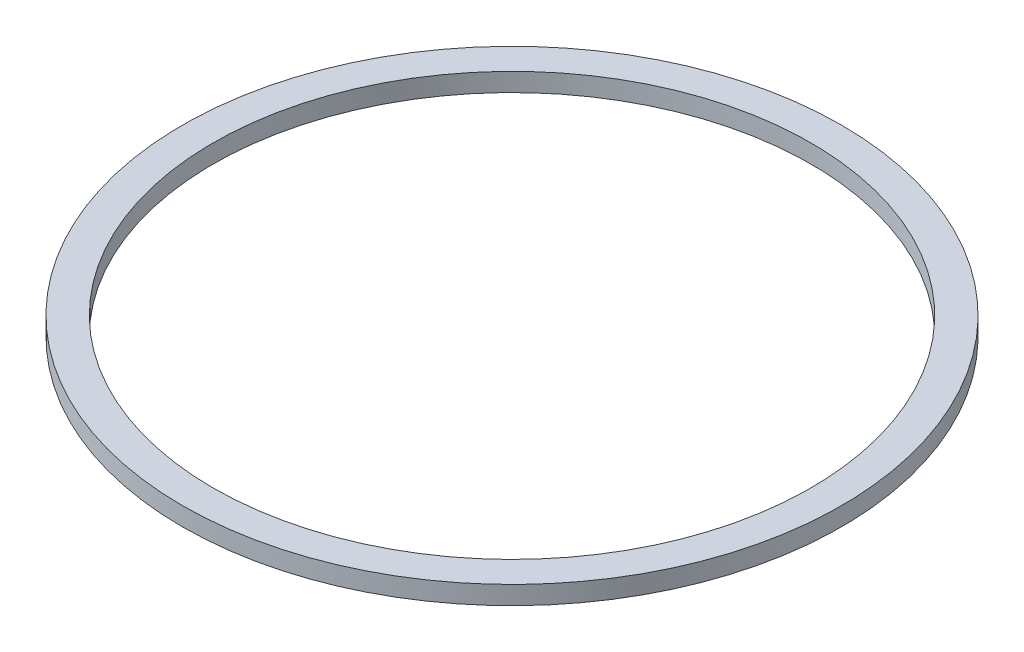
ISO-10303-21;
HEADER;
FILE_DESCRIPTION(('STEP AP214'),'2;1');
FILE_NAME('part.step','',(''),(''),'','','');
FILE_SCHEMA(('AUTOMOTIVE_DESIGN { 1 0 10303 214 1 1 1 1 }'));
ENDSEC;
DATA;
#1=APPLICATION_CONTEXT('core data for automotive mechanical design processes');
#2=APPLICATION_PROTOCOL_DEFINITION('international standard','automotive_design',2000,#1);
#3=PRODUCT_CONTEXT('',#1,'mechanical');
#4=PRODUCT('Part','Part','',(#3));
#5=PRODUCT_RELATED_PRODUCT_CATEGORY('part','',(#4));
#6=PRODUCT_DEFINITION_FORMATION('','',#4);
#7=PRODUCT_DEFINITION_CONTEXT('part definition',#1,'design');
#8=PRODUCT_DEFINITION('design','',#6,#7);
#9=PRODUCT_DEFINITION_SHAPE('','',#8);
#10=(LENGTH_UNIT() NAMED_UNIT(*) SI_UNIT(.MILLI.,.METRE.));
#11=(NAMED_UNIT(*) PLANE_ANGLE_UNIT() SI_UNIT($,.RADIAN.));
#12=(NAMED_UNIT(*) SI_UNIT($,.STERADIAN.) SOLID_ANGLE_UNIT());
#13=UNCERTAINTY_MEASURE_WITH_UNIT(LENGTH_MEASURE(1.E-05),#10,'distance_accuracy_value','');
#14=(GEOMETRIC_REPRESENTATION_CONTEXT(3) GLOBAL_UNCERTAINTY_ASSIGNED_CONTEXT((#13)) GLOBAL_UNIT_ASSIGNED_CONTEXT((#10,
#11,#12)) REPRESENTATION_CONTEXT('',''));
#15=CARTESIAN_POINT('',(0.,0.,0.));
#16=DIRECTION('',(0.,0.,1.));
#17=DIRECTION('',(1.,0.,0.));
#18=AXIS2_PLACEMENT_3D('',#15,#16,#17);
#19=CARTESIAN_POINT('',(0.,1.2,0.));
#20=DIRECTION('',(0.,1.,0.));
#21=DIRECTION('',(0.,0.,1.));
#22=AXIS2_PLACEMENT_3D('',#19,#20,#21);
#23=PLANE('',#22);
#24=CARTESIAN_POINT('',(0.,1.2,0.));
#25=DIRECTION('',(0.,1.,0.));
#26=DIRECTION('',(0.,0.,1.));
#27=AXIS2_PLACEMENT_3D('',#24,#25,#26);
#28=CIRCLE('',#27,21.5);
#29=CARTESIAN_POINT('',(0.,1.2,21.5));
#30=VERTEX_POINT('',#29);
#31=EDGE_CURVE('E10',#30,#30,#28,.T.);
#32=ORIENTED_EDGE('',*,*,#31,.T.);
#33=EDGE_LOOP('',(#32));
#34=FACE_BOUND('',#33,.T.);
#35=CARTESIAN_POINT('',(0.,1.2,0.));
#36=DIRECTION('',(0.,1.,0.));
#37=DIRECTION('',(0.,0.,1.));
#38=AXIS2_PLACEMENT_3D('',#35,#36,#37);
#39=CIRCLE('',#38,19.5);
#40=CARTESIAN_POINT('',(0.,1.2,19.5));
#41=VERTEX_POINT('',#40);
#42=EDGE_CURVE('E50',#41,#41,#39,.T.);
#43=ORIENTED_EDGE('',*,*,#42,.F.);
#44=EDGE_LOOP('',(#43));
#45=FACE_BOUND('',#44,.T.);
#46=ADVANCED_FACE('F37',(#34,#45),#23,.T.);
#47=CARTESIAN_POINT('',(0.,0.,0.));
#48=DIRECTION('',(0.,1.,0.));
#49=DIRECTION('',(0.,0.,1.));
#50=AXIS2_PLACEMENT_3D('',#47,#48,#49);
#51=PLANE('',#50);
#52=CARTESIAN_POINT('',(0.,0.,0.));
#53=DIRECTION('',(0.,1.,0.));
#54=DIRECTION('',(0.,0.,1.));
#55=AXIS2_PLACEMENT_3D('',#52,#53,#54);
#56=CIRCLE('',#55,21.5);
#57=CARTESIAN_POINT('',(0.,0.,21.5));
#58=VERTEX_POINT('',#57);
#59=EDGE_CURVE('E41',#58,#58,#56,.T.);
#60=ORIENTED_EDGE('',*,*,#59,.F.);
#61=EDGE_LOOP('',(#60));
#62=FACE_BOUND('',#61,.T.);
#63=CARTESIAN_POINT('',(0.,0.,0.));
#64=DIRECTION('',(0.,1.,0.));
#65=DIRECTION('',(0.,0.,1.));
#66=AXIS2_PLACEMENT_3D('',#63,#64,#65);
#67=CIRCLE('',#66,19.5);
#68=CARTESIAN_POINT('',(0.,0.,19.5));
#69=VERTEX_POINT('',#68);
#70=EDGE_CURVE('E52',#69,#69,#67,.T.);
#71=ORIENTED_EDGE('',*,*,#70,.T.);
#72=EDGE_LOOP('',(#71));
#73=FACE_BOUND('',#72,.T.);
#74=ADVANCED_FACE('F64',(#62,#73),#51,.F.);
#75=CARTESIAN_POINT('',(0.,1.2,0.));
#76=DIRECTION('',(0.,-1.,0.));
#77=DIRECTION('',(0.,0.,-1.));
#78=AXIS2_PLACEMENT_3D('',#75,#76,#77);
#79=CYLINDRICAL_SURFACE('',#78,21.5);
#80=ORIENTED_EDGE('',*,*,#31,.F.);
#81=EDGE_LOOP('',(#80));
#82=FACE_BOUND('',#81,.T.);
#83=ORIENTED_EDGE('',*,*,#59,.T.);
#84=EDGE_LOOP('',(#83));
#85=FACE_BOUND('',#84,.T.);
#86=ADVANCED_FACE('F39',(#82,#85),#79,.T.);
#87=CARTESIAN_POINT('',(0.,1.2,0.));
#88=DIRECTION('',(0.,-1.,0.));
#89=DIRECTION('',(0.,0.,-1.));
#90=AXIS2_PLACEMENT_3D('',#87,#88,#89);
#91=CYLINDRICAL_SURFACE('',#90,19.5);
#92=ORIENTED_EDGE('',*,*,#42,.T.);
#93=EDGE_LOOP('',(#92));
#94=FACE_BOUND('',#93,.T.);
#95=ORIENTED_EDGE('',*,*,#70,.F.);
#96=EDGE_LOOP('',(#95));
#97=FACE_BOUND('',#96,.T.);
#98=ADVANCED_FACE('F60',(#94,#97),#91,.F.);
#99=CLOSED_SHELL('',(#46,#74,#86,#98));
#100=MANIFOLD_SOLID_BREP('B2',#99);
#101=ADVANCED_BREP_SHAPE_REPRESENTATION('',(#18,#100),#14);
#102=SHAPE_DEFINITION_REPRESENTATION(#9,#101);
ENDSEC;
END-ISO-10303-21;
